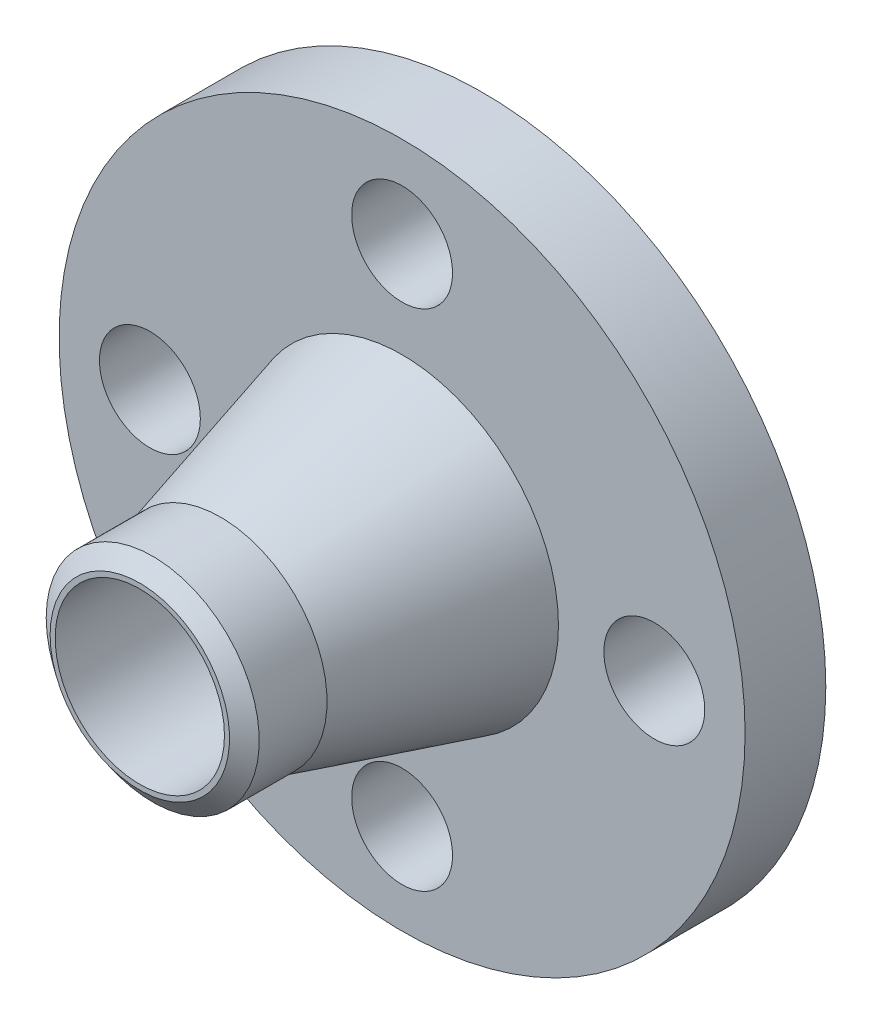
ISO-10303-21;
HEADER;
FILE_DESCRIPTION(('STEP AP214'),'2;1');
FILE_NAME('part.step','',(''),(''),'','','');
FILE_SCHEMA(('AUTOMOTIVE_DESIGN { 1 0 10303 214 1 1 1 1 }'));
ENDSEC;
DATA;
#1=APPLICATION_CONTEXT('core data for automotive mechanical design processes');
#2=APPLICATION_PROTOCOL_DEFINITION('international standard','automotive_design',2000,#1);
#3=PRODUCT_CONTEXT('',#1,'mechanical');
#4=PRODUCT('Part','Part','',(#3));
#5=PRODUCT_RELATED_PRODUCT_CATEGORY('part','',(#4));
#6=PRODUCT_DEFINITION_FORMATION('','',#4);
#7=PRODUCT_DEFINITION_CONTEXT('part definition',#1,'design');
#8=PRODUCT_DEFINITION('design','',#6,#7);
#9=PRODUCT_DEFINITION_SHAPE('','',#8);
#10=(LENGTH_UNIT() NAMED_UNIT(*) SI_UNIT(.MILLI.,.METRE.));
#11=(NAMED_UNIT(*) PLANE_ANGLE_UNIT() SI_UNIT($,.RADIAN.));
#12=(NAMED_UNIT(*) SI_UNIT($,.STERADIAN.) SOLID_ANGLE_UNIT());
#13=UNCERTAINTY_MEASURE_WITH_UNIT(LENGTH_MEASURE(1.E-05),#10,'distance_accuracy_value','');
#14=(GEOMETRIC_REPRESENTATION_CONTEXT(3) GLOBAL_UNCERTAINTY_ASSIGNED_CONTEXT((#13)) GLOBAL_UNIT_ASSIGNED_CONTEXT((#10,
#11,#12)) REPRESENTATION_CONTEXT('',''));
#15=CARTESIAN_POINT('',(0.,0.,0.));
#16=DIRECTION('',(0.,0.,1.));
#17=DIRECTION('',(1.,0.,0.));
#18=AXIS2_PLACEMENT_3D('',#15,#16,#17);
#19=CARTESIAN_POINT('',(0.,0.,0.));
#20=DIRECTION('',(0.,0.,1.));
#21=DIRECTION('',(1.,0.,0.));
#22=AXIS2_PLACEMENT_3D('',#19,#20,#21);
#23=PLANE('',#22);
#24=CARTESIAN_POINT('',(0.,0.,0.));
#25=DIRECTION('',(0.,0.,1.));
#26=DIRECTION('',(1.,0.,0.));
#27=AXIS2_PLACEMENT_3D('',#24,#25,#26);
#28=CIRCLE('',#27,25.4);
#29=CARTESIAN_POINT('',(25.4,0.,0.));
#30=VERTEX_POINT('',#29);
#31=EDGE_CURVE('E51',#30,#30,#28,.T.);
#32=ORIENTED_EDGE('',*,*,#31,.F.);
#33=EDGE_LOOP('',(#32));
#34=FACE_BOUND('',#33,.T.);
#35=CARTESIAN_POINT('',(0.,0.,0.));
#36=DIRECTION('',(0.,0.,1.));
#37=DIRECTION('',(1.,0.,0.));
#38=AXIS2_PLACEMENT_3D('',#35,#36,#37);
#39=CIRCLE('',#38,13.3223);
#40=CARTESIAN_POINT('',(13.3223,0.,0.));
#41=VERTEX_POINT('',#40);
#42=EDGE_CURVE('E99',#41,#41,#39,.T.);
#43=ORIENTED_EDGE('',*,*,#42,.T.);
#44=EDGE_LOOP('',(#43));
#45=FACE_BOUND('',#44,.T.);
#46=ADVANCED_FACE('F36',(#34,#45),#23,.F.);
#47=CARTESIAN_POINT('',(0.,0.,55.5625));
#48=DIRECTION('',(0.,0.,1.));
#49=DIRECTION('',(1.,0.,0.));
#50=AXIS2_PLACEMENT_3D('',#47,#48,#49);
#51=PLANE('',#50);
#52=CARTESIAN_POINT('',(0.,0.,55.5625));
#53=DIRECTION('',(0.,0.,-1.));
#54=DIRECTION('',(-1.,0.,0.));
#55=AXIS2_PLACEMENT_3D('',#52,#53,#54);
#56=CIRCLE('',#55,14.11605);
#57=CARTESIAN_POINT('',(-14.11605,0.,55.5625));
#58=VERTEX_POINT('',#57);
#59=EDGE_CURVE('E109',#58,#58,#56,.T.);
#60=ORIENTED_EDGE('',*,*,#59,.F.);
#61=EDGE_LOOP('',(#60));
#62=FACE_BOUND('',#61,.T.);
#63=CARTESIAN_POINT('',(0.,0.,55.5625));
#64=DIRECTION('',(0.,0.,-1.));
#65=DIRECTION('',(-1.,0.,0.));
#66=AXIS2_PLACEMENT_3D('',#63,#64,#65);
#67=CIRCLE('',#66,13.3223);
#68=CARTESIAN_POINT('',(13.3223,0.,55.5625));
#69=VERTEX_POINT('',#68);
#70=EDGE_CURVE('E98',#69,#69,#67,.T.);
#71=ORIENTED_EDGE('',*,*,#70,.T.);
#72=EDGE_LOOP('',(#71));
#73=FACE_BOUND('',#72,.T.);
#74=ADVANCED_FACE('F116',(#62,#73),#51,.T.);
#75=CARTESIAN_POINT('',(0.,0.,14.2875));
#76=DIRECTION('',(0.,0.,1.));
#77=DIRECTION('',(1.,0.,0.));
#78=AXIS2_PLACEMENT_3D('',#75,#76,#77);
#79=PLANE('',#78);
#80=CARTESIAN_POINT('',(2.77136331270674E-13,-39.6875,14.2875));
#81=DIRECTION('',(0.,0.,1.));
#82=DIRECTION('',(1.,0.,0.));
#83=AXIS2_PLACEMENT_3D('',#80,#81,#82);
#84=CIRCLE('',#83,7.9375);
#85=CARTESIAN_POINT('',(7.93750000000028,-39.6875,14.2875));
#86=VERTEX_POINT('',#85);
#87=EDGE_CURVE('E86',#86,#86,#84,.T.);
#88=ORIENTED_EDGE('',*,*,#87,.F.);
#89=EDGE_LOOP('',(#88));
#90=FACE_BOUND('',#89,.T.);
#91=CARTESIAN_POINT('',(0.,39.6875,14.2875));
#92=DIRECTION('',(0.,0.,1.));
#93=DIRECTION('',(1.,0.,0.));
#94=AXIS2_PLACEMENT_3D('',#91,#92,#93);
#95=CIRCLE('',#94,7.9375);
#96=CARTESIAN_POINT('',(7.9375,39.6875,14.2875));
#97=VERTEX_POINT('',#96);
#98=EDGE_CURVE('E71',#97,#97,#95,.T.);
#99=ORIENTED_EDGE('',*,*,#98,.F.);
#100=EDGE_LOOP('',(#99));
#101=FACE_BOUND('',#100,.T.);
#102=CARTESIAN_POINT('',(0.,0.,14.2875));
#103=DIRECTION('',(0.,0.,1.));
#104=DIRECTION('',(1.,0.,0.));
#105=AXIS2_PLACEMENT_3D('',#102,#103,#104);
#106=CIRCLE('',#105,24.60625);
#107=CARTESIAN_POINT('',(24.60625,0.,14.2875));
#108=VERTEX_POINT('',#107);
#109=EDGE_CURVE('E10',#108,#108,#106,.T.);
#110=ORIENTED_EDGE('',*,*,#109,.F.);
#111=EDGE_LOOP('',(#110));
#112=FACE_BOUND('',#111,.T.);
#113=CARTESIAN_POINT('',(0.,0.,14.2875));
#114=DIRECTION('',(0.,0.,1.));
#115=DIRECTION('',(1.,0.,0.));
#116=AXIS2_PLACEMENT_3D('',#113,#114,#115);
#117=CIRCLE('',#116,53.975);
#118=CARTESIAN_POINT('',(53.975,0.,14.2875));
#119=VERTEX_POINT('',#118);
#120=EDGE_CURVE('E58',#119,#119,#117,.T.);
#121=ORIENTED_EDGE('',*,*,#120,.T.);
#122=EDGE_LOOP('',(#121));
#123=FACE_BOUND('',#122,.T.);
#124=CARTESIAN_POINT('',(-39.6875,-1.38568165635337E-13,14.2875));
#125=DIRECTION('',(0.,0.,1.));
#126=DIRECTION('',(1.,0.,0.));
#127=AXIS2_PLACEMENT_3D('',#124,#125,#126);
#128=CIRCLE('',#127,7.9375);
#129=CARTESIAN_POINT('',(-31.75,-1.38568165635337E-13,14.2875));
#130=VERTEX_POINT('',#129);
#131=EDGE_CURVE('E78',#130,#130,#128,.T.);
#132=ORIENTED_EDGE('',*,*,#131,.F.);
#133=EDGE_LOOP('',(#132));
#134=FACE_BOUND('',#133,.T.);
#135=CARTESIAN_POINT('',(39.6875,4.15704496906011E-13,14.2875));
#136=DIRECTION('',(0.,0.,1.));
#137=DIRECTION('',(1.,0.,0.));
#138=AXIS2_PLACEMENT_3D('',#135,#136,#137);
#139=CIRCLE('',#138,7.9375);
#140=CARTESIAN_POINT('',(47.625,4.15704496906011E-13,14.2875));
#141=VERTEX_POINT('',#140);
#142=EDGE_CURVE('E92',#141,#141,#139,.T.);
#143=ORIENTED_EDGE('',*,*,#142,.F.);
#144=EDGE_LOOP('',(#143));
#145=FACE_BOUND('',#144,.T.);
#146=ADVANCED_FACE('F119',(#90,#101,#112,#123,#134,#145),#79,.T.);
#147=CARTESIAN_POINT('',(0.,0.,1.5875));
#148=DIRECTION('',(0.,0.,1.));
#149=DIRECTION('',(1.,0.,0.));
#150=AXIS2_PLACEMENT_3D('',#147,#148,#149);
#151=PLANE('',#150);
#152=CARTESIAN_POINT('',(2.77136331270674E-13,-39.6875,1.5875));
#153=DIRECTION('',(0.,0.,1.));
#154=DIRECTION('',(1.,0.,0.));
#155=AXIS2_PLACEMENT_3D('',#152,#153,#154);
#156=CIRCLE('',#155,7.9375);
#157=CARTESIAN_POINT('',(7.93750000000028,-39.6875,1.5875));
#158=VERTEX_POINT('',#157);
#159=EDGE_CURVE('E89',#158,#158,#156,.T.);
#160=ORIENTED_EDGE('',*,*,#159,.T.);
#161=EDGE_LOOP('',(#160));
#162=FACE_BOUND('',#161,.T.);
#163=CARTESIAN_POINT('',(0.,39.6875,1.5875));
#164=DIRECTION('',(0.,0.,1.));
#165=DIRECTION('',(1.,0.,0.));
#166=AXIS2_PLACEMENT_3D('',#163,#164,#165);
#167=CIRCLE('',#166,7.9375);
#168=CARTESIAN_POINT('',(7.9375,39.6875,1.5875));
#169=VERTEX_POINT('',#168);
#170=EDGE_CURVE('E75',#169,#169,#167,.T.);
#171=ORIENTED_EDGE('',*,*,#170,.T.);
#172=EDGE_LOOP('',(#171));
#173=FACE_BOUND('',#172,.T.);
#174=CARTESIAN_POINT('',(0.,0.,1.5875));
#175=DIRECTION('',(0.,0.,1.));
#176=DIRECTION('',(1.,0.,0.));
#177=AXIS2_PLACEMENT_3D('',#174,#175,#176);
#178=CIRCLE('',#177,53.975);
#179=CARTESIAN_POINT('',(53.975,0.,1.5875));
#180=VERTEX_POINT('',#179);
#181=EDGE_CURVE('E60',#180,#180,#178,.T.);
#182=ORIENTED_EDGE('',*,*,#181,.F.);
#183=EDGE_LOOP('',(#182));
#184=FACE_BOUND('',#183,.T.);
#185=CARTESIAN_POINT('',(0.,0.,1.5875));
#186=DIRECTION('',(0.,0.,1.));
#187=DIRECTION('',(1.,0.,0.));
#188=AXIS2_PLACEMENT_3D('',#185,#186,#187);
#189=CIRCLE('',#188,25.4);
#190=CARTESIAN_POINT('',(25.4,0.,1.5875));
#191=VERTEX_POINT('',#190);
#192=EDGE_CURVE('E44',#191,#191,#189,.T.);
#193=ORIENTED_EDGE('',*,*,#192,.T.);
#194=EDGE_LOOP('',(#193));
#195=FACE_BOUND('',#194,.T.);
#196=CARTESIAN_POINT('',(-39.6875,-1.38568165635337E-13,1.5875));
#197=DIRECTION('',(0.,0.,1.));
#198=DIRECTION('',(1.,0.,0.));
#199=AXIS2_PLACEMENT_3D('',#196,#197,#198);
#200=CIRCLE('',#199,7.9375);
#201=CARTESIAN_POINT('',(-31.75,-1.38568165635337E-13,1.5875));
#202=VERTEX_POINT('',#201);
#203=EDGE_CURVE('E82',#202,#202,#200,.T.);
#204=ORIENTED_EDGE('',*,*,#203,.T.);
#205=EDGE_LOOP('',(#204));
#206=FACE_BOUND('',#205,.T.);
#207=CARTESIAN_POINT('',(39.6875,4.15704496906011E-13,1.5875));
#208=DIRECTION('',(0.,0.,1.));
#209=DIRECTION('',(1.,0.,0.));
#210=AXIS2_PLACEMENT_3D('',#207,#208,#209);
#211=CIRCLE('',#210,7.9375);
#212=CARTESIAN_POINT('',(47.625,4.15704496906011E-13,1.5875));
#213=VERTEX_POINT('',#212);
#214=EDGE_CURVE('E95',#213,#213,#211,.T.);
#215=ORIENTED_EDGE('',*,*,#214,.T.);
#216=EDGE_LOOP('',(#215));
#217=FACE_BOUND('',#216,.T.);
#218=ADVANCED_FACE('F141',(#162,#173,#184,#195,#206,#217),#151,.F.);
#219=CARTESIAN_POINT('',(0.,0.,1.5875));
#220=DIRECTION('',(0.,0.,-1.));
#221=DIRECTION('',(-1.,0.,0.));
#222=AXIS2_PLACEMENT_3D('',#219,#220,#221);
#223=CYLINDRICAL_SURFACE('',#222,25.4);
#224=ORIENTED_EDGE('',*,*,#192,.F.);
#225=EDGE_LOOP('',(#224));
#226=FACE_BOUND('',#225,.T.);
#227=ORIENTED_EDGE('',*,*,#31,.T.);
#228=EDGE_LOOP('',(#227));
#229=FACE_BOUND('',#228,.T.);
#230=ADVANCED_FACE('F38',(#226,#229),#223,.T.);
#231=CARTESIAN_POINT('',(0.,0.,14.2875));
#232=DIRECTION('',(0.,0.,-1.));
#233=DIRECTION('',(-1.,0.,0.));
#234=AXIS2_PLACEMENT_3D('',#231,#232,#233);
#235=CYLINDRICAL_SURFACE('',#234,53.975);
#236=ORIENTED_EDGE('',*,*,#120,.F.);
#237=EDGE_LOOP('',(#236));
#238=FACE_BOUND('',#237,.T.);
#239=ORIENTED_EDGE('',*,*,#181,.T.);
#240=EDGE_LOOP('',(#239));
#241=FACE_BOUND('',#240,.T.);
#242=ADVANCED_FACE('F136',(#238,#241),#235,.T.);
#243=CARTESIAN_POINT('',(0.,0.,14.2875));
#244=DIRECTION('',(0.,0.,-1.));
#245=DIRECTION('',(-1.,0.,0.));
#246=AXIS2_PLACEMENT_3D('',#243,#244,#245);
#247=CONICAL_SURFACE('',#246,24.60625,0.267849642002814);
#248=CARTESIAN_POINT('',(0.,0.,42.8625));
#249=DIRECTION('',(0.,0.,-1.));
#250=DIRECTION('',(-1.,0.,0.));
#251=AXIS2_PLACEMENT_3D('',#248,#249,#250);
#252=CIRCLE('',#251,16.764);
#253=CARTESIAN_POINT('',(-16.764,0.,42.8625));
#254=VERTEX_POINT('',#253);
#255=EDGE_CURVE('E64',#254,#254,#252,.T.);
#256=ORIENTED_EDGE('',*,*,#255,.T.);
#257=EDGE_LOOP('',(#256));
#258=FACE_BOUND('',#257,.T.);
#259=ORIENTED_EDGE('',*,*,#109,.T.);
#260=EDGE_LOOP('',(#259));
#261=FACE_BOUND('',#260,.T.);
#262=ADVANCED_FACE('F139',(#258,#261),#247,.T.);
#263=CARTESIAN_POINT('',(0.,0.,55.5625));
#264=DIRECTION('',(0.,0.,-1.));
#265=DIRECTION('',(-1.,0.,0.));
#266=AXIS2_PLACEMENT_3D('',#263,#264,#265);
#267=CYLINDRICAL_SURFACE('',#266,16.764);
#268=CARTESIAN_POINT('',(0.,0.,53.5306565021811));
#269=DIRECTION('',(0.,0.,-1.));
#270=DIRECTION('',(-1.,0.,0.));
#271=AXIS2_PLACEMENT_3D('',#268,#269,#270);
#272=CIRCLE('',#271,16.764);
#273=CARTESIAN_POINT('',(-16.764,0.,53.5306565021811));
#274=VERTEX_POINT('',#273);
#275=EDGE_CURVE('E102',#274,#274,#272,.T.);
#276=ORIENTED_EDGE('',*,*,#275,.T.);
#277=EDGE_LOOP('',(#276));
#278=FACE_BOUND('',#277,.T.);
#279=ORIENTED_EDGE('',*,*,#255,.F.);
#280=EDGE_LOOP('',(#279));
#281=FACE_BOUND('',#280,.T.);
#282=ADVANCED_FACE('F148',(#278,#281),#267,.T.);
#283=CARTESIAN_POINT('',(0.,39.6875,36.7381403026729));
#284=DIRECTION('',(0.,0.,-1.));
#285=DIRECTION('',(-1.,0.,0.));
#286=AXIS2_PLACEMENT_3D('',#283,#284,#285);
#287=CYLINDRICAL_SURFACE('',#286,7.9375);
#288=ORIENTED_EDGE('',*,*,#170,.F.);
#289=EDGE_LOOP('',(#288));
#290=FACE_BOUND('',#289,.T.);
#291=ORIENTED_EDGE('',*,*,#98,.T.);
#292=EDGE_LOOP('',(#291));
#293=FACE_BOUND('',#292,.T.);
#294=ADVANCED_FACE('F150',(#290,#293),#287,.F.);
#295=CARTESIAN_POINT('',(-39.6875,-1.38568165635337E-13,36.7381403026729));
#296=DIRECTION('',(0.,0.,-1.));
#297=DIRECTION('',(-1.,0.,0.));
#298=AXIS2_PLACEMENT_3D('',#295,#296,#297);
#299=CYLINDRICAL_SURFACE('',#298,7.9375);
#300=ORIENTED_EDGE('',*,*,#203,.F.);
#301=EDGE_LOOP('',(#300));
#302=FACE_BOUND('',#301,.T.);
#303=ORIENTED_EDGE('',*,*,#131,.T.);
#304=EDGE_LOOP('',(#303));
#305=FACE_BOUND('',#304,.T.);
#306=ADVANCED_FACE('F158',(#302,#305),#299,.F.);
#307=CARTESIAN_POINT('',(2.77136331270674E-13,-39.6875,36.7381403026729));
#308=DIRECTION('',(0.,0.,-1.));
#309=DIRECTION('',(-1.,0.,0.));
#310=AXIS2_PLACEMENT_3D('',#307,#308,#309);
#311=CYLINDRICAL_SURFACE('',#310,7.9375);
#312=ORIENTED_EDGE('',*,*,#159,.F.);
#313=EDGE_LOOP('',(#312));
#314=FACE_BOUND('',#313,.T.);
#315=ORIENTED_EDGE('',*,*,#87,.T.);
#316=EDGE_LOOP('',(#315));
#317=FACE_BOUND('',#316,.T.);
#318=ADVANCED_FACE('F162',(#314,#317),#311,.F.);
#319=CARTESIAN_POINT('',(39.6875,4.15704496906011E-13,36.7381403026729));
#320=DIRECTION('',(0.,0.,-1.));
#321=DIRECTION('',(-1.,0.,0.));
#322=AXIS2_PLACEMENT_3D('',#319,#320,#321);
#323=CYLINDRICAL_SURFACE('',#322,7.9375);
#324=ORIENTED_EDGE('',*,*,#214,.F.);
#325=EDGE_LOOP('',(#324));
#326=FACE_BOUND('',#325,.T.);
#327=ORIENTED_EDGE('',*,*,#142,.T.);
#328=EDGE_LOOP('',(#327));
#329=FACE_BOUND('',#328,.T.);
#330=ADVANCED_FACE('F126',(#326,#329),#323,.F.);
#331=CARTESIAN_POINT('',(0.,0.,-0.001000000000001));
#332=DIRECTION('',(0.,0.,1.));
#333=DIRECTION('',(1.,0.,0.));
#334=AXIS2_PLACEMENT_3D('',#331,#332,#333);
#335=CYLINDRICAL_SURFACE('',#334,13.3223);
#336=CARTESIAN_POINT('',(13.3223,0.,55.5625));
#337=CARTESIAN_POINT('',(13.3223,0.,54.9837239583333));
#338=CARTESIAN_POINT('',(13.3223,0.,54.4049479166667));
#339=CARTESIAN_POINT('',(13.3223,0.,53.2473958333333));
#340=CARTESIAN_POINT('',(13.3223,0.,52.6686197916667));
#341=CARTESIAN_POINT('',(13.3223,0.,51.5110677083333));
#342=CARTESIAN_POINT('',(13.3223,0.,50.9322916666667));
#343=CARTESIAN_POINT('',(13.3223,0.,49.7747395833333));
#344=CARTESIAN_POINT('',(13.3223,0.,49.1959635416667));
#345=CARTESIAN_POINT('',(13.3223,0.,48.0384114583333));
#346=CARTESIAN_POINT('',(13.3223,0.,47.4596354166667));
#347=CARTESIAN_POINT('',(13.3223,0.,46.3020833333333));
#348=CARTESIAN_POINT('',(13.3223,0.,45.7233072916667));
#349=CARTESIAN_POINT('',(13.3223,0.,44.5657552083333));
#350=CARTESIAN_POINT('',(13.3223,0.,43.9869791666667));
#351=CARTESIAN_POINT('',(13.3223,0.,42.8294270833333));
#352=CARTESIAN_POINT('',(13.3223,0.,42.2506510416667));
#353=CARTESIAN_POINT('',(13.3223,0.,41.0930989583333));
#354=CARTESIAN_POINT('',(13.3223,0.,40.5143229166667));
#355=CARTESIAN_POINT('',(13.3223,0.,39.3567708333333));
#356=CARTESIAN_POINT('',(13.3223,0.,38.7779947916667));
#357=CARTESIAN_POINT('',(13.3223,0.,37.6204427083333));
#358=CARTESIAN_POINT('',(13.3223,0.,37.0416666666667));
#359=CARTESIAN_POINT('',(13.3223,0.,35.8841145833333));
#360=CARTESIAN_POINT('',(13.3223,0.,35.3053385416667));
#361=CARTESIAN_POINT('',(13.3223,0.,34.1477864583333));
#362=CARTESIAN_POINT('',(13.3223,0.,33.5690104166667));
#363=CARTESIAN_POINT('',(13.3223,0.,32.4114583333333));
#364=CARTESIAN_POINT('',(13.3223,0.,31.8326822916667));
#365=CARTESIAN_POINT('',(13.3223,0.,30.6751302083333));
#366=CARTESIAN_POINT('',(13.3223,0.,30.0963541666667));
#367=CARTESIAN_POINT('',(13.3223,0.,28.9388020833333));
#368=CARTESIAN_POINT('',(13.3223,0.,28.3600260416667));
#369=CARTESIAN_POINT('',(13.3223,0.,27.2024739583333));
#370=CARTESIAN_POINT('',(13.3223,0.,26.6236979166667));
#371=CARTESIAN_POINT('',(13.3223,0.,25.4661458333333));
#372=CARTESIAN_POINT('',(13.3223,0.,24.8873697916667));
#373=CARTESIAN_POINT('',(13.3223,0.,23.7298177083333));
#374=CARTESIAN_POINT('',(13.3223,0.,23.1510416666667));
#375=CARTESIAN_POINT('',(13.3223,0.,21.9934895833333));
#376=CARTESIAN_POINT('',(13.3223,0.,21.4147135416667));
#377=CARTESIAN_POINT('',(13.3223,0.,20.2571614583333));
#378=CARTESIAN_POINT('',(13.3223,0.,19.6783854166667));
#379=CARTESIAN_POINT('',(13.3223,0.,18.5208333333333));
#380=CARTESIAN_POINT('',(13.3223,0.,17.9420572916667));
#381=CARTESIAN_POINT('',(13.3223,0.,16.7845052083333));
#382=CARTESIAN_POINT('',(13.3223,0.,16.2057291666667));
#383=CARTESIAN_POINT('',(13.3223,0.,15.0481770833333));
#384=CARTESIAN_POINT('',(13.3223,0.,14.4694010416667));
#385=CARTESIAN_POINT('',(13.3223,0.,13.3118489583333));
#386=CARTESIAN_POINT('',(13.3223,0.,12.7330729166667));
#387=CARTESIAN_POINT('',(13.3223,0.,11.5755208333333));
#388=CARTESIAN_POINT('',(13.3223,0.,10.9967447916667));
#389=CARTESIAN_POINT('',(13.3223,0.,9.83919270833334));
#390=CARTESIAN_POINT('',(13.3223,0.,9.26041666666667));
#391=CARTESIAN_POINT('',(13.3223,0.,8.10286458333333));
#392=CARTESIAN_POINT('',(13.3223,0.,7.52408854166667));
#393=CARTESIAN_POINT('',(13.3223,0.,6.36653645833333));
#394=CARTESIAN_POINT('',(13.3223,0.,5.78776041666667));
#395=CARTESIAN_POINT('',(13.3223,0.,4.63020833333333));
#396=CARTESIAN_POINT('',(13.3223,0.,4.05143229166667));
#397=CARTESIAN_POINT('',(13.3223,0.,2.89388020833333));
#398=CARTESIAN_POINT('',(13.3223,0.,2.31510416666667));
#399=CARTESIAN_POINT('',(13.3223,0.,1.15755208333333));
#400=CARTESIAN_POINT('',(13.3223,0.,0.578776041666665));
#401=CARTESIAN_POINT('',(13.3223,0.,0.));
#402=B_SPLINE_CURVE_WITH_KNOTS('',3,(#336,#337,#338,#339,#340,#341,#342,#343,#344,#345,#346,
#347,#348,#349,#350,#351,#352,#353,#354,#355,#356,#357,#358,#359,#360,#361,#362,#363,#364,#365,
#366,#367,#368,#369,#370,#371,#372,#373,#374,#375,#376,#377,#378,#379,#380,#381,#382,#383,#384,
#385,#386,#387,#388,#389,#390,#391,#392,#393,#394,#395,#396,#397,#398,#399,#400,#401),
.UNSPECIFIED.,.F.,.F.,(4,2,2,2,2,2,2,2,2,2,2,2,2,2,2,2,2,2,2,2,2,2,2,2,2,2,2,2,2,2,2,2,4),(0.,
1.736328125,3.47265625,5.208984375,6.9453125,8.681640625,10.41796875,12.154296875,13.890625,
15.626953125,17.36328125,19.099609375,20.8359375,22.572265625,24.30859375,26.044921875,27.78125,
29.517578125,31.25390625,32.990234375,34.7265625,36.462890625,38.19921875,39.935546875,
41.671875,43.408203125,45.14453125,46.880859375,48.6171875,50.353515625,52.08984375,
53.826171875,55.5625),.UNSPECIFIED.);
#403=EDGE_CURVE('BSEAM123',#69,#41,#402,.T.);
#404=ORIENTED_EDGE('',*,*,#70,.F.);
#405=ORIENTED_EDGE('',*,*,#42,.F.);
#406=ORIENTED_EDGE('',*,*,#403,.T.);
#407=ORIENTED_EDGE('',*,*,#403,.F.);
#408=EDGE_LOOP('',(#404,#406,#405,#407));
#409=FACE_BOUND('',#408,.T.);
#410=ADVANCED_FACE('F123',(#409),#335,.F.);
#411=CARTESIAN_POINT('',(0.,0.,55.5625));
#412=DIRECTION('',(0.,0.,-1.));
#413=DIRECTION('',(-1.,0.,0.));
#414=AXIS2_PLACEMENT_3D('',#411,#412,#413);
#415=CONICAL_SURFACE('',#414,14.11605,0.91629785729703);
#416=ORIENTED_EDGE('',*,*,#275,.F.);
#417=EDGE_LOOP('',(#416));
#418=FACE_BOUND('',#417,.T.);
#419=ORIENTED_EDGE('',*,*,#59,.T.);
#420=EDGE_LOOP('',(#419));
#421=FACE_BOUND('',#420,.T.);
#422=ADVANCED_FACE('F114',(#418,#421),#415,.T.);
#423=CLOSED_SHELL('',(#46,#74,#146,#218,#230,#242,#262,#282,#294,#306,#318,#330,#410,#422));
#424=MANIFOLD_SOLID_BREP('B2',#423);
#425=ADVANCED_BREP_SHAPE_REPRESENTATION('',(#18,#424),#14);
#426=SHAPE_DEFINITION_REPRESENTATION(#9,#425);
ENDSEC;
END-ISO-10303-21;
